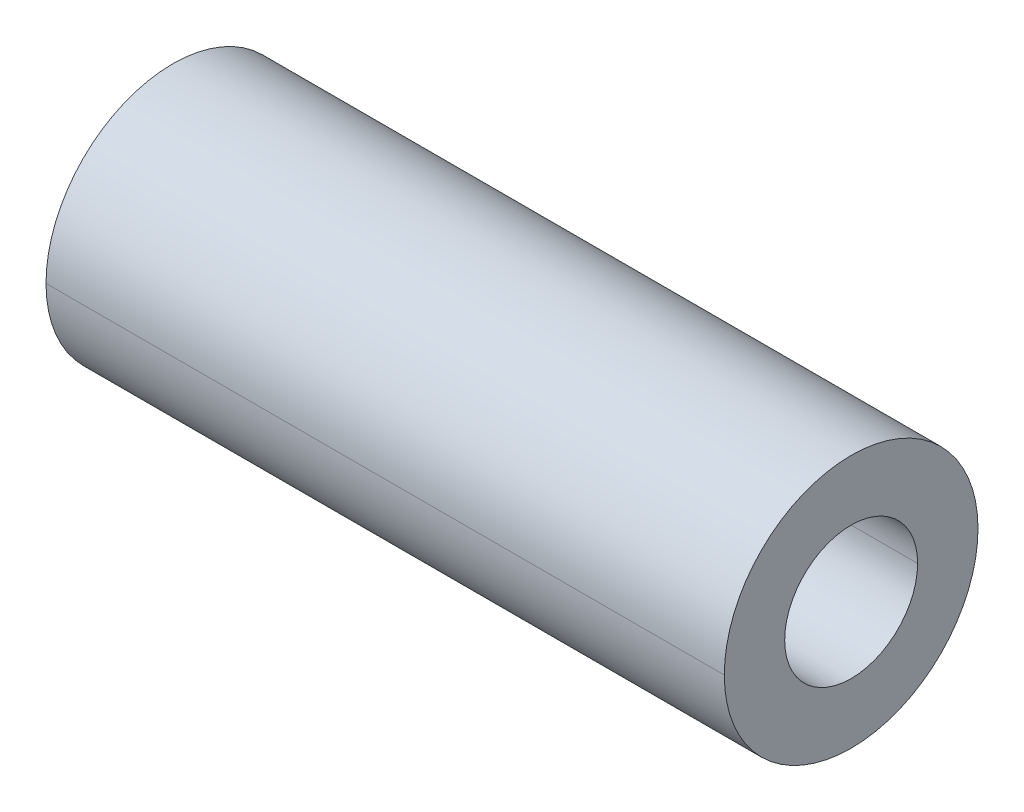
ISO-10303-21;
HEADER;
FILE_DESCRIPTION(('STEP AP214'),'2;1');
FILE_NAME('part.step','',(''),(''),'','','');
FILE_SCHEMA(('AUTOMOTIVE_DESIGN { 1 0 10303 214 1 1 1 1 }'));
ENDSEC;
DATA;
#1=APPLICATION_CONTEXT('core data for automotive mechanical design processes');
#2=APPLICATION_PROTOCOL_DEFINITION('international standard','automotive_design',2000,#1);
#3=PRODUCT_CONTEXT('',#1,'mechanical');
#4=PRODUCT('Part','Part','',(#3));
#5=PRODUCT_RELATED_PRODUCT_CATEGORY('part','',(#4));
#6=PRODUCT_DEFINITION_FORMATION('','',#4);
#7=PRODUCT_DEFINITION_CONTEXT('part definition',#1,'design');
#8=PRODUCT_DEFINITION('design','',#6,#7);
#9=PRODUCT_DEFINITION_SHAPE('','',#8);
#10=(LENGTH_UNIT() NAMED_UNIT(*) SI_UNIT(.MILLI.,.METRE.));
#11=(NAMED_UNIT(*) PLANE_ANGLE_UNIT() SI_UNIT($,.RADIAN.));
#12=(NAMED_UNIT(*) SI_UNIT($,.STERADIAN.) SOLID_ANGLE_UNIT());
#13=UNCERTAINTY_MEASURE_WITH_UNIT(LENGTH_MEASURE(1.E-05),#10,'distance_accuracy_value','');
#14=(GEOMETRIC_REPRESENTATION_CONTEXT(3) GLOBAL_UNCERTAINTY_ASSIGNED_CONTEXT((#13)) GLOBAL_UNIT_ASSIGNED_CONTEXT((#10,
#11,#12)) REPRESENTATION_CONTEXT('',''));
#15=CARTESIAN_POINT('',(0.,0.,0.));
#16=DIRECTION('',(0.,0.,1.));
#17=DIRECTION('',(1.,0.,0.));
#18=AXIS2_PLACEMENT_3D('',#15,#16,#17);
#19=CARTESIAN_POINT('',(12.7,0.,0.));
#20=DIRECTION('',(-1.,0.,0.));
#21=DIRECTION('',(0.,0.,1.));
#22=AXIS2_PLACEMENT_3D('',#19,#20,#21);
#23=CYLINDRICAL_SURFACE('',#22,2.4892);
#24=DIRECTION('',(-1.,0.,0.));
#25=VECTOR('',#24,1.);
#26=CARTESIAN_POINT('',(12.7,0.,-2.4892));
#27=LINE('',#26,#25);
#28=CARTESIAN_POINT('',(12.7,0.,-2.4892));
#29=VERTEX_POINT('',#28);
#30=CARTESIAN_POINT('',(-12.7,0.,-2.4892));
#31=VERTEX_POINT('',#30);
#32=EDGE_CURVE('E72',#29,#31,#27,.T.);
#33=ORIENTED_EDGE('',*,*,#32,.F.);
#34=CARTESIAN_POINT('',(12.7,0.,0.));
#35=DIRECTION('',(1.,0.,0.));
#36=DIRECTION('',(0.,0.,-1.));
#37=AXIS2_PLACEMENT_3D('',#34,#35,#36);
#38=CIRCLE('',#37,2.4892);
#39=CARTESIAN_POINT('',(12.7,0.,2.4892));
#40=VERTEX_POINT('',#39);
#41=EDGE_CURVE('E104',#29,#40,#38,.T.);
#42=ORIENTED_EDGE('',*,*,#41,.T.);
#43=DIRECTION('',(-1.,0.,0.));
#44=VECTOR('',#43,1.);
#45=CARTESIAN_POINT('',(12.7,0.,2.4892));
#46=LINE('',#45,#44);
#47=CARTESIAN_POINT('',(-12.7,0.,2.4892));
#48=VERTEX_POINT('',#47);
#49=EDGE_CURVE('E75',#40,#48,#46,.T.);
#50=ORIENTED_EDGE('',*,*,#49,.T.);
#51=CARTESIAN_POINT('',(-12.7,0.,0.));
#52=DIRECTION('',(1.,0.,0.));
#53=DIRECTION('',(0.,0.,-1.));
#54=AXIS2_PLACEMENT_3D('',#51,#52,#53);
#55=CIRCLE('',#54,2.4892);
#56=EDGE_CURVE('E10',#31,#48,#55,.T.);
#57=ORIENTED_EDGE('',*,*,#56,.F.);
#58=EDGE_LOOP('',(#33,#42,#50,#57));
#59=FACE_BOUND('',#58,.T.);
#60=ADVANCED_FACE('F16',(#59),#23,.F.);
#61=CARTESIAN_POINT('',(12.7,0.,0.));
#62=DIRECTION('',(-1.,0.,0.));
#63=DIRECTION('',(0.,0.,1.));
#64=AXIS2_PLACEMENT_3D('',#61,#62,#63);
#65=CYLINDRICAL_SURFACE('',#64,4.7498);
#66=DIRECTION('',(-1.,0.,0.));
#67=VECTOR('',#66,1.);
#68=CARTESIAN_POINT('',(12.7,0.,-4.7498));
#69=LINE('',#68,#67);
#70=CARTESIAN_POINT('',(12.7,0.,-4.7498));
#71=VERTEX_POINT('',#70);
#72=CARTESIAN_POINT('',(-12.7,0.,-4.7498));
#73=VERTEX_POINT('',#72);
#74=EDGE_CURVE('E96',#71,#73,#69,.T.);
#75=ORIENTED_EDGE('',*,*,#74,.F.);
#76=CARTESIAN_POINT('',(12.7,0.,0.));
#77=DIRECTION('',(1.,0.,0.));
#78=DIRECTION('',(0.,0.,-1.));
#79=AXIS2_PLACEMENT_3D('',#76,#77,#78);
#80=CIRCLE('',#79,4.7498);
#81=CARTESIAN_POINT('',(12.7,0.,4.7498));
#82=VERTEX_POINT('',#81);
#83=EDGE_CURVE('E101',#82,#71,#80,.T.);
#84=ORIENTED_EDGE('',*,*,#83,.F.);
#85=DIRECTION('',(-1.,0.,0.));
#86=VECTOR('',#85,1.);
#87=CARTESIAN_POINT('',(12.7,0.,4.7498));
#88=LINE('',#87,#86);
#89=CARTESIAN_POINT('',(-12.7,0.,4.7498));
#90=VERTEX_POINT('',#89);
#91=EDGE_CURVE('E105',#82,#90,#88,.T.);
#92=ORIENTED_EDGE('',*,*,#91,.T.);
#93=CARTESIAN_POINT('',(-12.7,0.,0.));
#94=DIRECTION('',(1.,0.,0.));
#95=DIRECTION('',(0.,0.,-1.));
#96=AXIS2_PLACEMENT_3D('',#93,#94,#95);
#97=CIRCLE('',#96,4.7498);
#98=EDGE_CURVE('E19',#90,#73,#97,.T.);
#99=ORIENTED_EDGE('',*,*,#98,.T.);
#100=EDGE_LOOP('',(#75,#84,#92,#99));
#101=FACE_BOUND('',#100,.T.);
#102=ADVANCED_FACE('F156',(#101),#65,.T.);
#103=CARTESIAN_POINT('',(-12.7,0.,0.));
#104=DIRECTION('',(1.,0.,0.));
#105=DIRECTION('',(0.,1.,0.));
#106=AXIS2_PLACEMENT_3D('',#103,#104,#105);
#107=PLANE('',#106);
#108=CARTESIAN_POINT('',(-12.7,0.,0.));
#109=DIRECTION('',(1.,0.,0.));
#110=DIRECTION('',(0.,0.,-1.));
#111=AXIS2_PLACEMENT_3D('',#108,#109,#110);
#112=CIRCLE('',#111,2.4892);
#113=EDGE_CURVE('E78',#48,#31,#112,.T.);
#114=ORIENTED_EDGE('',*,*,#113,.T.);
#115=ORIENTED_EDGE('',*,*,#56,.T.);
#116=EDGE_LOOP('',(#114,#115));
#117=FACE_BOUND('',#116,.T.);
#118=ORIENTED_EDGE('',*,*,#98,.F.);
#119=CARTESIAN_POINT('',(-12.7,0.,0.));
#120=DIRECTION('',(1.,0.,0.));
#121=DIRECTION('',(0.,0.,-1.));
#122=AXIS2_PLACEMENT_3D('',#119,#120,#121);
#123=CIRCLE('',#122,4.7498);
#124=EDGE_CURVE('E108',#73,#90,#123,.T.);
#125=ORIENTED_EDGE('',*,*,#124,.F.);
#126=EDGE_LOOP('',(#118,#125));
#127=FACE_BOUND('',#126,.T.);
#128=ADVANCED_FACE('F79',(#117,#127),#107,.F.);
#129=CARTESIAN_POINT('',(12.7,0.,0.));
#130=DIRECTION('',(1.,0.,0.));
#131=DIRECTION('',(0.,1.,0.));
#132=AXIS2_PLACEMENT_3D('',#129,#130,#131);
#133=PLANE('',#132);
#134=CARTESIAN_POINT('',(12.7,0.,0.));
#135=DIRECTION('',(1.,0.,0.));
#136=DIRECTION('',(0.,0.,-1.));
#137=AXIS2_PLACEMENT_3D('',#134,#135,#136);
#138=CIRCLE('',#137,2.4892);
#139=EDGE_CURVE('E85',#40,#29,#138,.T.);
#140=ORIENTED_EDGE('',*,*,#139,.F.);
#141=ORIENTED_EDGE('',*,*,#41,.F.);
#142=EDGE_LOOP('',(#140,#141));
#143=FACE_BOUND('',#142,.T.);
#144=ORIENTED_EDGE('',*,*,#83,.T.);
#145=CARTESIAN_POINT('',(12.7,0.,0.));
#146=DIRECTION('',(1.,0.,0.));
#147=DIRECTION('',(0.,0.,-1.));
#148=AXIS2_PLACEMENT_3D('',#145,#146,#147);
#149=CIRCLE('',#148,4.7498);
#150=EDGE_CURVE('E98',#71,#82,#149,.T.);
#151=ORIENTED_EDGE('',*,*,#150,.T.);
#152=EDGE_LOOP('',(#144,#151));
#153=FACE_BOUND('',#152,.T.);
#154=ADVANCED_FACE('F131',(#143,#153),#133,.T.);
#155=CARTESIAN_POINT('',(12.7,0.,0.));
#156=DIRECTION('',(-1.,0.,0.));
#157=DIRECTION('',(0.,0.,1.));
#158=AXIS2_PLACEMENT_3D('',#155,#156,#157);
#159=CYLINDRICAL_SURFACE('',#158,4.7498);
#160=ORIENTED_EDGE('',*,*,#150,.F.);
#161=ORIENTED_EDGE('',*,*,#74,.T.);
#162=ORIENTED_EDGE('',*,*,#124,.T.);
#163=ORIENTED_EDGE('',*,*,#91,.F.);
#164=EDGE_LOOP('',(#160,#161,#162,#163));
#165=FACE_BOUND('',#164,.T.);
#166=ADVANCED_FACE('F126',(#165),#159,.T.);
#167=CARTESIAN_POINT('',(12.7,0.,0.));
#168=DIRECTION('',(-1.,0.,0.));
#169=DIRECTION('',(0.,0.,1.));
#170=AXIS2_PLACEMENT_3D('',#167,#168,#169);
#171=CYLINDRICAL_SURFACE('',#170,2.4892);
#172=ORIENTED_EDGE('',*,*,#139,.T.);
#173=ORIENTED_EDGE('',*,*,#32,.T.);
#174=ORIENTED_EDGE('',*,*,#113,.F.);
#175=ORIENTED_EDGE('',*,*,#49,.F.);
#176=EDGE_LOOP('',(#172,#173,#174,#175));
#177=FACE_BOUND('',#176,.T.);
#178=ADVANCED_FACE('F83',(#177),#171,.F.);
#179=CLOSED_SHELL('',(#60,#102,#128,#154,#166,#178));
#180=MANIFOLD_SOLID_BREP('B1',#179);
#181=ADVANCED_BREP_SHAPE_REPRESENTATION('',(#18,#180),#14);
#182=SHAPE_DEFINITION_REPRESENTATION(#9,#181);
ENDSEC;
END-ISO-10303-21;
